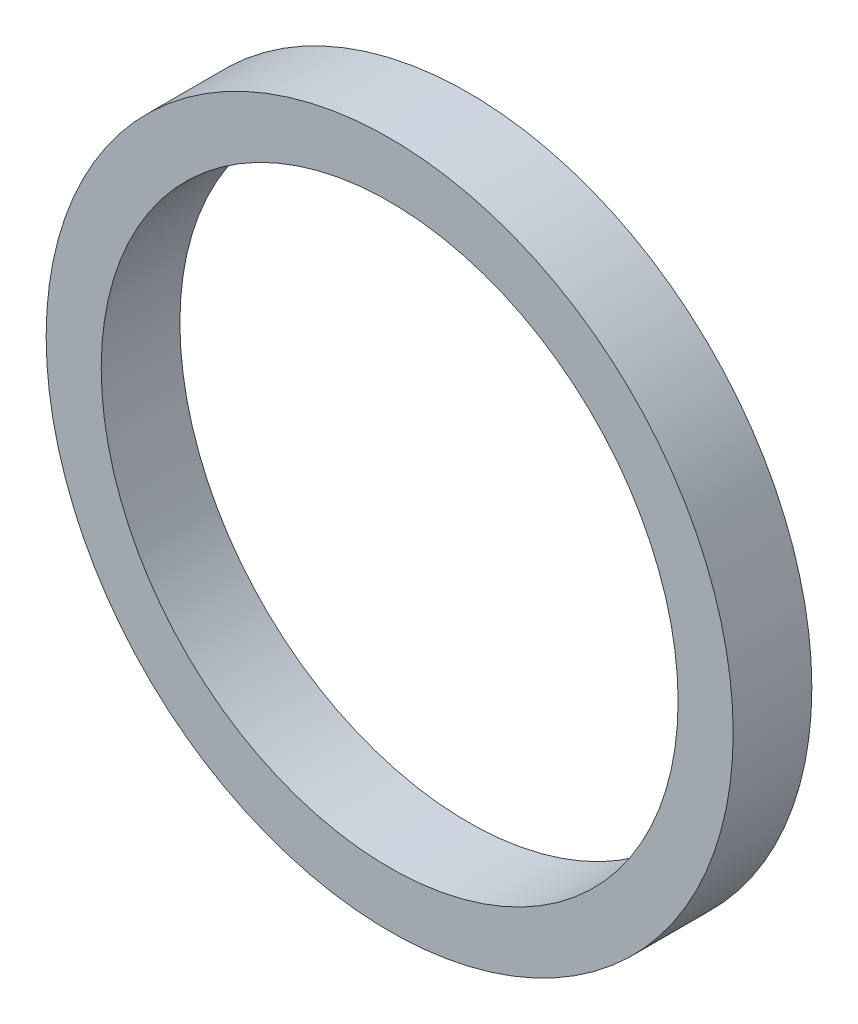
ISO-10303-21;
HEADER;
FILE_DESCRIPTION(('STEP AP214'),'2;1');
FILE_NAME('part.step','',(''),(''),'','','');
FILE_SCHEMA(('AUTOMOTIVE_DESIGN { 1 0 10303 214 1 1 1 1 }'));
ENDSEC;
DATA;
#1=APPLICATION_CONTEXT('core data for automotive mechanical design processes');
#2=APPLICATION_PROTOCOL_DEFINITION('international standard','automotive_design',2000,#1);
#3=PRODUCT_CONTEXT('',#1,'mechanical');
#4=PRODUCT('Part','Part','',(#3));
#5=PRODUCT_RELATED_PRODUCT_CATEGORY('part','',(#4));
#6=PRODUCT_DEFINITION_FORMATION('','',#4);
#7=PRODUCT_DEFINITION_CONTEXT('part definition',#1,'design');
#8=PRODUCT_DEFINITION('design','',#6,#7);
#9=PRODUCT_DEFINITION_SHAPE('','',#8);
#10=(LENGTH_UNIT() NAMED_UNIT(*) SI_UNIT(.MILLI.,.METRE.));
#11=(NAMED_UNIT(*) PLANE_ANGLE_UNIT() SI_UNIT($,.RADIAN.));
#12=(NAMED_UNIT(*) SI_UNIT($,.STERADIAN.) SOLID_ANGLE_UNIT());
#13=UNCERTAINTY_MEASURE_WITH_UNIT(LENGTH_MEASURE(1.E-05),#10,'distance_accuracy_value','');
#14=(GEOMETRIC_REPRESENTATION_CONTEXT(3) GLOBAL_UNCERTAINTY_ASSIGNED_CONTEXT((#13)) GLOBAL_UNIT_ASSIGNED_CONTEXT((#10,
#11,#12)) REPRESENTATION_CONTEXT('',''));
#15=CARTESIAN_POINT('',(0.,0.,0.));
#16=DIRECTION('',(0.,0.,1.));
#17=DIRECTION('',(1.,0.,0.));
#18=AXIS2_PLACEMENT_3D('',#15,#16,#17);
#19=CARTESIAN_POINT('',(0.,0.,1.5));
#20=DIRECTION('',(0.,0.,-1.));
#21=DIRECTION('',(-1.,0.,0.));
#22=AXIS2_PLACEMENT_3D('',#19,#20,#21);
#23=CYLINDRICAL_SURFACE('',#22,11.);
#24=CARTESIAN_POINT('',(0.,0.,1.5));
#25=DIRECTION('',(0.,0.,1.));
#26=DIRECTION('',(1.,0.,0.));
#27=AXIS2_PLACEMENT_3D('',#24,#25,#26);
#28=CIRCLE('',#27,11.);
#29=CARTESIAN_POINT('',(11.,0.,1.5));
#30=VERTEX_POINT('',#29);
#31=EDGE_CURVE('E40',#30,#30,#28,.T.);
#32=ORIENTED_EDGE('',*,*,#31,.T.);
#33=EDGE_LOOP('',(#32));
#34=FACE_BOUND('',#33,.T.);
#35=CARTESIAN_POINT('',(0.,0.,-1.5));
#36=DIRECTION('',(0.,0.,1.));
#37=DIRECTION('',(1.,0.,0.));
#38=AXIS2_PLACEMENT_3D('',#35,#36,#37);
#39=CIRCLE('',#38,11.);
#40=CARTESIAN_POINT('',(11.,0.,-1.5));
#41=VERTEX_POINT('',#40);
#42=EDGE_CURVE('E46',#41,#41,#39,.T.);
#43=ORIENTED_EDGE('',*,*,#42,.F.);
#44=EDGE_LOOP('',(#43));
#45=FACE_BOUND('',#44,.T.);
#46=ADVANCED_FACE('F33',(#34,#45),#23,.F.);
#47=CARTESIAN_POINT('',(0.,0.,1.5));
#48=DIRECTION('',(0.,0.,-1.));
#49=DIRECTION('',(-1.,0.,0.));
#50=AXIS2_PLACEMENT_3D('',#47,#48,#49);
#51=CYLINDRICAL_SURFACE('',#50,13.1);
#52=CARTESIAN_POINT('',(0.,0.,1.5));
#53=DIRECTION('',(0.,0.,1.));
#54=DIRECTION('',(1.,0.,0.));
#55=AXIS2_PLACEMENT_3D('',#52,#53,#54);
#56=CIRCLE('',#55,13.1);
#57=CARTESIAN_POINT('',(13.1,0.,1.5));
#58=VERTEX_POINT('',#57);
#59=EDGE_CURVE('E10',#58,#58,#56,.T.);
#60=ORIENTED_EDGE('',*,*,#59,.F.);
#61=EDGE_LOOP('',(#60));
#62=FACE_BOUND('',#61,.T.);
#63=CARTESIAN_POINT('',(0.,0.,-1.5));
#64=DIRECTION('',(0.,0.,1.));
#65=DIRECTION('',(1.,0.,0.));
#66=AXIS2_PLACEMENT_3D('',#63,#64,#65);
#67=CIRCLE('',#66,13.1);
#68=CARTESIAN_POINT('',(13.1,0.,-1.5));
#69=VERTEX_POINT('',#68);
#70=EDGE_CURVE('E36',#69,#69,#67,.T.);
#71=ORIENTED_EDGE('',*,*,#70,.T.);
#72=EDGE_LOOP('',(#71));
#73=FACE_BOUND('',#72,.T.);
#74=ADVANCED_FACE('F53',(#62,#73),#51,.T.);
#75=CARTESIAN_POINT('',(0.,0.,1.5));
#76=DIRECTION('',(0.,0.,1.));
#77=DIRECTION('',(1.,0.,0.));
#78=AXIS2_PLACEMENT_3D('',#75,#76,#77);
#79=PLANE('',#78);
#80=ORIENTED_EDGE('',*,*,#31,.F.);
#81=EDGE_LOOP('',(#80));
#82=FACE_BOUND('',#81,.T.);
#83=ORIENTED_EDGE('',*,*,#59,.T.);
#84=EDGE_LOOP('',(#83));
#85=FACE_BOUND('',#84,.T.);
#86=ADVANCED_FACE('F57',(#82,#85),#79,.T.);
#87=CARTESIAN_POINT('',(0.,0.,-1.5));
#88=DIRECTION('',(0.,0.,1.));
#89=DIRECTION('',(1.,0.,0.));
#90=AXIS2_PLACEMENT_3D('',#87,#88,#89);
#91=PLANE('',#90);
#92=ORIENTED_EDGE('',*,*,#42,.T.);
#93=EDGE_LOOP('',(#92));
#94=FACE_BOUND('',#93,.T.);
#95=ORIENTED_EDGE('',*,*,#70,.F.);
#96=EDGE_LOOP('',(#95));
#97=FACE_BOUND('',#96,.T.);
#98=ADVANCED_FACE('F55',(#94,#97),#91,.F.);
#99=CLOSED_SHELL('',(#46,#74,#86,#98));
#100=MANIFOLD_SOLID_BREP('B2',#99);
#101=ADVANCED_BREP_SHAPE_REPRESENTATION('',(#18,#100),#14);
#102=SHAPE_DEFINITION_REPRESENTATION(#9,#101);
ENDSEC;
END-ISO-10303-21;
